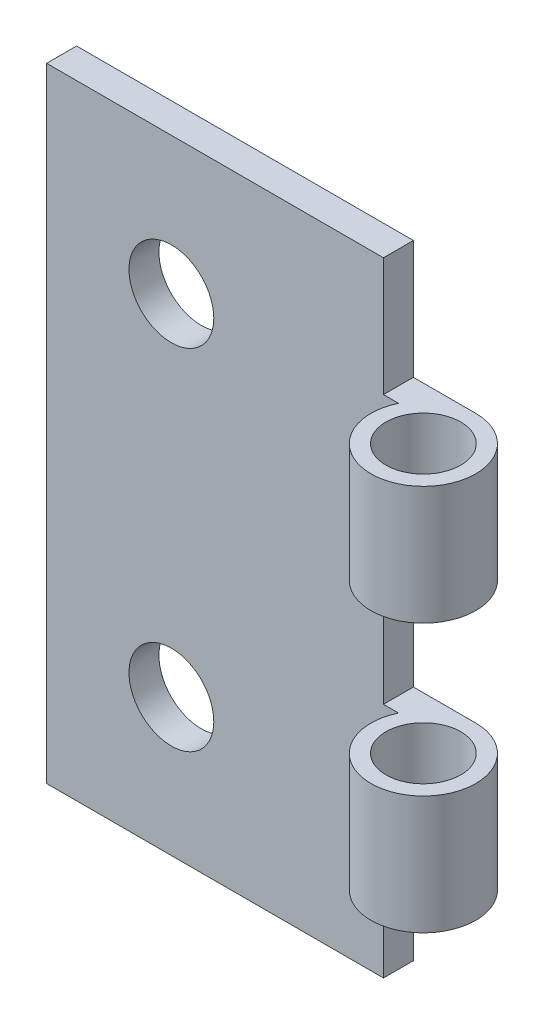
ISO-10303-21;
HEADER;
FILE_DESCRIPTION(('STEP AP214'),'2;1');
FILE_NAME('part.step','',(''),(''),'','','');
FILE_SCHEMA(('AUTOMOTIVE_DESIGN { 1 0 10303 214 1 1 1 1 }'));
ENDSEC;
DATA;
#1=APPLICATION_CONTEXT('core data for automotive mechanical design processes');
#2=APPLICATION_PROTOCOL_DEFINITION('international standard','automotive_design',2000,#1);
#3=PRODUCT_CONTEXT('',#1,'mechanical');
#4=PRODUCT('Part','Part','',(#3));
#5=PRODUCT_RELATED_PRODUCT_CATEGORY('part','',(#4));
#6=PRODUCT_DEFINITION_FORMATION('','',#4);
#7=PRODUCT_DEFINITION_CONTEXT('part definition',#1,'design');
#8=PRODUCT_DEFINITION('design','',#6,#7);
#9=PRODUCT_DEFINITION_SHAPE('','',#8);
#10=(LENGTH_UNIT() NAMED_UNIT(*) SI_UNIT(.MILLI.,.METRE.));
#11=(NAMED_UNIT(*) PLANE_ANGLE_UNIT() SI_UNIT($,.RADIAN.));
#12=(NAMED_UNIT(*) SI_UNIT($,.STERADIAN.) SOLID_ANGLE_UNIT());
#13=UNCERTAINTY_MEASURE_WITH_UNIT(LENGTH_MEASURE(1.E-05),#10,'distance_accuracy_value','');
#14=(GEOMETRIC_REPRESENTATION_CONTEXT(3) GLOBAL_UNCERTAINTY_ASSIGNED_CONTEXT((#13)) GLOBAL_UNIT_ASSIGNED_CONTEXT((#10,
#11,#12)) REPRESENTATION_CONTEXT('',''));
#15=CARTESIAN_POINT('',(0.,0.,0.));
#16=DIRECTION('',(0.,0.,1.));
#17=DIRECTION('',(1.,0.,0.));
#18=AXIS2_PLACEMENT_3D('',#15,#16,#17);
#19=CARTESIAN_POINT('',(9.25,7.75,2.1));
#20=DIRECTION('',(0.,-1.,0.));
#21=DIRECTION('',(0.,0.,-1.));
#22=AXIS2_PLACEMENT_3D('',#19,#20,#21);
#23=CYLINDRICAL_SURFACE('',#22,2.1);
#24=CARTESIAN_POINT('',(9.25,3.,2.1));
#25=DIRECTION('',(0.,1.,0.));
#26=DIRECTION('',(0.,0.,1.));
#27=AXIS2_PLACEMENT_3D('',#24,#25,#26);
#28=CIRCLE('',#27,2.1);
#29=CARTESIAN_POINT('',(9.25,3.,0.));
#30=VERTEX_POINT('',#29);
#31=CARTESIAN_POINT('',(7.35263340389897,3.,1.2));
#32=VERTEX_POINT('',#31);
#33=EDGE_CURVE('E212',#30,#32,#28,.F.);
#34=ORIENTED_EDGE('',*,*,#33,.F.);
#35=DIRECTION('',(0.,-1.,0.));
#36=VECTOR('',#35,1.);
#37=CARTESIAN_POINT('',(9.25,0.,0.));
#38=LINE('',#37,#36);
#39=CARTESIAN_POINT('',(9.25,7.75,0.));
#40=VERTEX_POINT('',#39);
#41=EDGE_CURVE('E178',#40,#30,#38,.T.);
#42=ORIENTED_EDGE('',*,*,#41,.F.);
#43=CARTESIAN_POINT('',(9.25,7.75,2.1));
#44=DIRECTION('',(0.,-1.,0.));
#45=DIRECTION('',(0.,0.,-1.));
#46=AXIS2_PLACEMENT_3D('',#43,#44,#45);
#47=CIRCLE('',#46,2.1);
#48=CARTESIAN_POINT('',(7.35263340389897,7.75,1.2));
#49=VERTEX_POINT('',#48);
#50=EDGE_CURVE('E218',#40,#49,#47,.T.);
#51=ORIENTED_EDGE('',*,*,#50,.T.);
#52=DIRECTION('',(0.,-1.,0.));
#53=VECTOR('',#52,1.);
#54=CARTESIAN_POINT('',(7.35263340389897,7.75,1.2));
#55=LINE('',#54,#53);
#56=EDGE_CURVE('E143',#49,#32,#55,.T.);
#57=ORIENTED_EDGE('',*,*,#56,.T.);
#58=EDGE_LOOP('',(#34,#42,#51,#57));
#59=FACE_BOUND('',#58,.T.);
#60=ADVANCED_FACE('F36',(#59),#23,.T.);
#61=CARTESIAN_POINT('',(9.25,10.25,2.1));
#62=DIRECTION('',(0.,-1.,0.));
#63=DIRECTION('',(0.,0.,-1.));
#64=AXIS2_PLACEMENT_3D('',#61,#62,#63);
#65=CYLINDRICAL_SURFACE('',#64,1.5);
#66=CARTESIAN_POINT('',(9.25,3.,2.1));
#67=DIRECTION('',(0.,1.,0.));
#68=DIRECTION('',(0.,0.,1.));
#69=AXIS2_PLACEMENT_3D('',#66,#67,#68);
#70=CIRCLE('',#69,1.5);
#71=CARTESIAN_POINT('',(9.25,3.,3.6));
#72=VERTEX_POINT('',#71);
#73=EDGE_CURVE('E40',#72,#72,#70,.F.);
#74=ORIENTED_EDGE('',*,*,#73,.T.);
#75=EDGE_LOOP('',(#74));
#76=FACE_BOUND('',#75,.T.);
#77=CARTESIAN_POINT('',(9.25,7.75,2.1));
#78=DIRECTION('',(0.,1.,0.));
#79=DIRECTION('',(-1.,0.,0.));
#80=AXIS2_PLACEMENT_3D('',#77,#78,#79);
#81=CIRCLE('',#80,1.5);
#82=CARTESIAN_POINT('',(7.75,7.75,2.1));
#83=VERTEX_POINT('',#82);
#84=EDGE_CURVE('E194',#83,#83,#81,.T.);
#85=ORIENTED_EDGE('',*,*,#84,.T.);
#86=EDGE_LOOP('',(#85));
#87=FACE_BOUND('',#86,.T.);
#88=ADVANCED_FACE('F275',(#76,#87),#65,.F.);
#89=CARTESIAN_POINT('',(-6.75,0.,1.2));
#90=DIRECTION('',(-1.,0.,0.));
#91=DIRECTION('',(0.,0.,1.));
#92=AXIS2_PLACEMENT_3D('',#89,#90,#91);
#93=PLANE('',#92);
#94=DIRECTION('',(0.,1.,0.));
#95=VECTOR('',#94,1.);
#96=CARTESIAN_POINT('',(-6.75,0.,0.));
#97=LINE('',#96,#95);
#98=CARTESIAN_POINT('',(-6.75,-12.5,0.));
#99=VERTEX_POINT('',#98);
#100=CARTESIAN_POINT('',(-6.75,12.5,0.));
#101=VERTEX_POINT('',#100);
#102=EDGE_CURVE('E156',#99,#101,#97,.T.);
#103=ORIENTED_EDGE('',*,*,#102,.F.);
#104=DIRECTION('',(0.,0.,-1.));
#105=VECTOR('',#104,1.);
#106=CARTESIAN_POINT('',(-6.75,-12.5,1.2));
#107=LINE('',#106,#105);
#108=CARTESIAN_POINT('',(-6.75,-12.5,1.2));
#109=VERTEX_POINT('',#108);
#110=EDGE_CURVE('E11',#109,#99,#107,.T.);
#111=ORIENTED_EDGE('',*,*,#110,.F.);
#112=DIRECTION('',(0.,1.,0.));
#113=VECTOR('',#112,1.);
#114=CARTESIAN_POINT('',(-6.75,0.,1.2));
#115=LINE('',#114,#113);
#116=CARTESIAN_POINT('',(-6.75,12.5,1.2));
#117=VERTEX_POINT('',#116);
#118=EDGE_CURVE('E231',#109,#117,#115,.T.);
#119=ORIENTED_EDGE('',*,*,#118,.T.);
#120=DIRECTION('',(0.,0.,-1.));
#121=VECTOR('',#120,1.);
#122=CARTESIAN_POINT('',(-6.75,12.5,1.2));
#123=LINE('',#122,#121);
#124=EDGE_CURVE('E97',#117,#101,#123,.T.);
#125=ORIENTED_EDGE('',*,*,#124,.T.);
#126=EDGE_LOOP('',(#103,#111,#119,#125));
#127=FACE_BOUND('',#126,.T.);
#128=ADVANCED_FACE('F281',(#127),#93,.T.);
#129=CARTESIAN_POINT('',(0.,-12.5,1.2));
#130=DIRECTION('',(0.,-1.,0.));
#131=DIRECTION('',(1.,0.,0.));
#132=AXIS2_PLACEMENT_3D('',#129,#130,#131);
#133=PLANE('',#132);
#134=DIRECTION('',(-1.,0.,0.));
#135=VECTOR('',#134,1.);
#136=CARTESIAN_POINT('',(0.,-12.5,0.));
#137=LINE('',#136,#135);
#138=CARTESIAN_POINT('',(6.75,-12.5,0.));
#139=VERTEX_POINT('',#138);
#140=EDGE_CURVE('E158',#139,#99,#137,.T.);
#141=ORIENTED_EDGE('',*,*,#140,.F.);
#142=DIRECTION('',(0.,0.,-1.));
#143=VECTOR('',#142,1.);
#144=CARTESIAN_POINT('',(6.75,-12.5,1.2));
#145=LINE('',#144,#143);
#146=CARTESIAN_POINT('',(6.75,-12.5,1.2));
#147=VERTEX_POINT('',#146);
#148=EDGE_CURVE('E46',#147,#139,#145,.T.);
#149=ORIENTED_EDGE('',*,*,#148,.F.);
#150=DIRECTION('',(-1.,0.,0.));
#151=VECTOR('',#150,1.);
#152=CARTESIAN_POINT('',(0.,-12.5,1.2));
#153=LINE('',#152,#151);
#154=EDGE_CURVE('E233',#147,#109,#153,.T.);
#155=ORIENTED_EDGE('',*,*,#154,.T.);
#156=ORIENTED_EDGE('',*,*,#110,.T.);
#157=EDGE_LOOP('',(#141,#149,#155,#156));
#158=FACE_BOUND('',#157,.T.);
#159=ADVANCED_FACE('F303',(#158),#133,.T.);
#160=CARTESIAN_POINT('',(6.75,0.,1.2));
#161=DIRECTION('',(-1.,0.,0.));
#162=DIRECTION('',(0.,0.,1.));
#163=AXIS2_PLACEMENT_3D('',#160,#161,#162);
#164=PLANE('',#163);
#165=DIRECTION('',(0.,1.,0.));
#166=VECTOR('',#165,1.);
#167=CARTESIAN_POINT('',(6.75,0.,0.));
#168=LINE('',#167,#166);
#169=CARTESIAN_POINT('',(6.75,-7.75,0.));
#170=VERTEX_POINT('',#169);
#171=EDGE_CURVE('E161',#139,#170,#168,.T.);
#172=ORIENTED_EDGE('',*,*,#171,.T.);
#173=DIRECTION('',(0.,0.,-1.));
#174=VECTOR('',#173,1.);
#175=CARTESIAN_POINT('',(6.75,-7.75,1.2));
#176=LINE('',#175,#174);
#177=CARTESIAN_POINT('',(6.75,-7.75,1.2));
#178=VERTEX_POINT('',#177);
#179=EDGE_CURVE('E190',#178,#170,#176,.T.);
#180=ORIENTED_EDGE('',*,*,#179,.F.);
#181=DIRECTION('',(0.,1.,0.));
#182=VECTOR('',#181,1.);
#183=CARTESIAN_POINT('',(6.75,0.,1.2));
#184=LINE('',#183,#182);
#185=EDGE_CURVE('E137',#147,#178,#184,.T.);
#186=ORIENTED_EDGE('',*,*,#185,.F.);
#187=ORIENTED_EDGE('',*,*,#148,.T.);
#188=EDGE_LOOP('',(#172,#180,#186,#187));
#189=FACE_BOUND('',#188,.T.);
#190=ADVANCED_FACE('F270',(#189),#164,.F.);
#191=CARTESIAN_POINT('',(0.,-7.75,1.2));
#192=DIRECTION('',(0.,1.,0.));
#193=DIRECTION('',(0.,0.,1.));
#194=AXIS2_PLACEMENT_3D('',#191,#192,#193);
#195=PLANE('',#194);
#196=CARTESIAN_POINT('',(9.25,-7.75,2.1));
#197=DIRECTION('',(0.,-1.,0.));
#198=DIRECTION('',(0.,0.,-1.));
#199=AXIS2_PLACEMENT_3D('',#196,#197,#198);
#200=CIRCLE('',#199,1.5);
#201=CARTESIAN_POINT('',(9.25,-7.75,0.600000000000002));
#202=VERTEX_POINT('',#201);
#203=EDGE_CURVE('E197',#202,#202,#200,.T.);
#204=ORIENTED_EDGE('',*,*,#203,.F.);
#205=EDGE_LOOP('',(#204));
#206=FACE_BOUND('',#205,.T.);
#207=DIRECTION('',(1.,0.,0.));
#208=VECTOR('',#207,1.);
#209=CARTESIAN_POINT('',(0.,-7.75,0.));
#210=LINE('',#209,#208);
#211=CARTESIAN_POINT('',(9.25,-7.75,0.));
#212=VERTEX_POINT('',#211);
#213=EDGE_CURVE('E164',#170,#212,#210,.T.);
#214=ORIENTED_EDGE('',*,*,#213,.T.);
#215=CARTESIAN_POINT('',(9.25,-7.75,2.1));
#216=DIRECTION('',(0.,-1.,0.));
#217=DIRECTION('',(0.,0.,-1.));
#218=AXIS2_PLACEMENT_3D('',#215,#216,#217);
#219=CIRCLE('',#218,2.1);
#220=CARTESIAN_POINT('',(7.35263340389897,-7.75,1.2));
#221=VERTEX_POINT('',#220);
#222=EDGE_CURVE('E196',#212,#221,#219,.T.);
#223=ORIENTED_EDGE('',*,*,#222,.T.);
#224=DIRECTION('',(1.,0.,0.));
#225=VECTOR('',#224,1.);
#226=CARTESIAN_POINT('',(0.,-7.75,1.2));
#227=LINE('',#226,#225);
#228=EDGE_CURVE('E237',#178,#221,#227,.T.);
#229=ORIENTED_EDGE('',*,*,#228,.F.);
#230=ORIENTED_EDGE('',*,*,#179,.T.);
#231=EDGE_LOOP('',(#214,#223,#229,#230));
#232=FACE_BOUND('',#231,.T.);
#233=ADVANCED_FACE('F263',(#206,#232),#195,.F.);
#234=CARTESIAN_POINT('',(0.,-3.,1.2));
#235=DIRECTION('',(0.,1.,0.));
#236=DIRECTION('',(-1.,0.,0.));
#237=AXIS2_PLACEMENT_3D('',#234,#235,#236);
#238=PLANE('',#237);
#239=DIRECTION('',(1.,0.,0.));
#240=VECTOR('',#239,1.);
#241=CARTESIAN_POINT('',(0.,-3.,1.2));
#242=LINE('',#241,#240);
#243=CARTESIAN_POINT('',(6.75,-3.,1.2));
#244=VERTEX_POINT('',#243);
#245=CARTESIAN_POINT('',(7.35263340389897,-3.,1.2));
#246=VERTEX_POINT('',#245);
#247=EDGE_CURVE('E239',#244,#246,#242,.T.);
#248=ORIENTED_EDGE('',*,*,#247,.T.);
#249=CARTESIAN_POINT('',(9.25,-3.,2.1));
#250=DIRECTION('',(0.,-1.,0.));
#251=DIRECTION('',(1.,0.,0.));
#252=AXIS2_PLACEMENT_3D('',#249,#250,#251);
#253=CIRCLE('',#252,2.1);
#254=CARTESIAN_POINT('',(9.25,-3.,0.));
#255=VERTEX_POINT('',#254);
#256=EDGE_CURVE('E200',#246,#255,#253,.F.);
#257=ORIENTED_EDGE('',*,*,#256,.T.);
#258=DIRECTION('',(1.,0.,0.));
#259=VECTOR('',#258,1.);
#260=CARTESIAN_POINT('',(0.,-3.,0.));
#261=LINE('',#260,#259);
#262=CARTESIAN_POINT('',(6.75,-3.,0.));
#263=VERTEX_POINT('',#262);
#264=EDGE_CURVE('E172',#263,#255,#261,.T.);
#265=ORIENTED_EDGE('',*,*,#264,.F.);
#266=DIRECTION('',(0.,0.,-1.));
#267=VECTOR('',#266,1.);
#268=CARTESIAN_POINT('',(6.75,-3.,1.2));
#269=LINE('',#268,#267);
#270=EDGE_CURVE('E188',#244,#263,#269,.T.);
#271=ORIENTED_EDGE('',*,*,#270,.F.);
#272=EDGE_LOOP('',(#248,#257,#265,#271));
#273=FACE_BOUND('',#272,.T.);
#274=CARTESIAN_POINT('',(9.25,-3.,2.1));
#275=DIRECTION('',(0.,-1.,0.));
#276=DIRECTION('',(1.,0.,0.));
#277=AXIS2_PLACEMENT_3D('',#274,#275,#276);
#278=CIRCLE('',#277,1.5);
#279=CARTESIAN_POINT('',(10.75,-3.,2.1));
#280=VERTEX_POINT('',#279);
#281=EDGE_CURVE('E198',#280,#280,#278,.F.);
#282=ORIENTED_EDGE('',*,*,#281,.F.);
#283=EDGE_LOOP('',(#282));
#284=FACE_BOUND('',#283,.T.);
#285=ADVANCED_FACE('F260',(#273,#284),#238,.T.);
#286=CARTESIAN_POINT('',(6.75,3.,0.));
#287=VERTEX_POINT('',#286);
#288=EDGE_CURVE('E166',#263,#287,#168,.T.);
#289=ORIENTED_EDGE('',*,*,#288,.T.);
#290=DIRECTION('',(0.,0.,-1.));
#291=VECTOR('',#290,1.);
#292=CARTESIAN_POINT('',(6.75,3.,1.2));
#293=LINE('',#292,#291);
#294=CARTESIAN_POINT('',(6.75,3.,1.2));
#295=VERTEX_POINT('',#294);
#296=EDGE_CURVE('E129',#295,#287,#293,.T.);
#297=ORIENTED_EDGE('',*,*,#296,.F.);
#298=EDGE_CURVE('E136',#244,#295,#184,.T.);
#299=ORIENTED_EDGE('',*,*,#298,.F.);
#300=ORIENTED_EDGE('',*,*,#270,.T.);
#301=EDGE_LOOP('',(#289,#297,#299,#300));
#302=FACE_BOUND('',#301,.T.);
#303=ADVANCED_FACE('F248',(#302),#164,.F.);
#304=CARTESIAN_POINT('',(0.,3.,1.2));
#305=DIRECTION('',(0.,1.,0.));
#306=DIRECTION('',(-1.,0.,0.));
#307=AXIS2_PLACEMENT_3D('',#304,#305,#306);
#308=PLANE('',#307);
#309=DIRECTION('',(1.,0.,0.));
#310=VECTOR('',#309,1.);
#311=CARTESIAN_POINT('',(0.,3.,0.));
#312=LINE('',#311,#310);
#313=EDGE_CURVE('E175',#287,#30,#312,.T.);
#314=ORIENTED_EDGE('',*,*,#313,.T.);
#315=ORIENTED_EDGE('',*,*,#33,.T.);
#316=DIRECTION('',(1.,0.,0.));
#317=VECTOR('',#316,1.);
#318=CARTESIAN_POINT('',(0.,3.,1.2));
#319=LINE('',#318,#317);
#320=EDGE_CURVE('E144',#295,#32,#319,.T.);
#321=ORIENTED_EDGE('',*,*,#320,.F.);
#322=ORIENTED_EDGE('',*,*,#296,.T.);
#323=EDGE_LOOP('',(#314,#315,#321,#322));
#324=FACE_BOUND('',#323,.T.);
#325=ORIENTED_EDGE('',*,*,#73,.F.);
#326=EDGE_LOOP('',(#325));
#327=FACE_BOUND('',#326,.T.);
#328=ADVANCED_FACE('F251',(#324,#327),#308,.F.);
#329=CARTESIAN_POINT('',(0.,7.74999999999999,1.2));
#330=DIRECTION('',(0.,1.,0.));
#331=DIRECTION('',(-1.,0.,0.));
#332=AXIS2_PLACEMENT_3D('',#329,#330,#331);
#333=PLANE('',#332);
#334=ORIENTED_EDGE('',*,*,#84,.F.);
#335=EDGE_LOOP('',(#334));
#336=FACE_BOUND('',#335,.T.);
#337=ORIENTED_EDGE('',*,*,#50,.F.);
#338=DIRECTION('',(1.,0.,0.));
#339=VECTOR('',#338,1.);
#340=CARTESIAN_POINT('',(0.,7.74999999999999,0.));
#341=LINE('',#340,#339);
#342=CARTESIAN_POINT('',(6.75,7.75,0.));
#343=VERTEX_POINT('',#342);
#344=EDGE_CURVE('E126',#343,#40,#341,.T.);
#345=ORIENTED_EDGE('',*,*,#344,.F.);
#346=DIRECTION('',(0.,0.,-1.));
#347=VECTOR('',#346,1.);
#348=CARTESIAN_POINT('',(6.75,7.75,1.2));
#349=LINE('',#348,#347);
#350=CARTESIAN_POINT('',(6.75,7.75,1.2));
#351=VERTEX_POINT('',#350);
#352=EDGE_CURVE('E118',#351,#343,#349,.T.);
#353=ORIENTED_EDGE('',*,*,#352,.F.);
#354=DIRECTION('',(1.,0.,0.));
#355=VECTOR('',#354,1.);
#356=CARTESIAN_POINT('',(0.,7.74999999999999,1.2));
#357=LINE('',#356,#355);
#358=EDGE_CURVE('E124',#351,#49,#357,.T.);
#359=ORIENTED_EDGE('',*,*,#358,.T.);
#360=EDGE_LOOP('',(#337,#345,#353,#359));
#361=FACE_BOUND('',#360,.T.);
#362=ADVANCED_FACE('F121',(#336,#361),#333,.T.);
#363=CARTESIAN_POINT('',(6.75,12.5,0.));
#364=VERTEX_POINT('',#363);
#365=EDGE_CURVE('E165',#343,#364,#168,.T.);
#366=ORIENTED_EDGE('',*,*,#365,.T.);
#367=DIRECTION('',(0.,0.,-1.));
#368=VECTOR('',#367,1.);
#369=CARTESIAN_POINT('',(6.75,12.5,1.2));
#370=LINE('',#369,#368);
#371=CARTESIAN_POINT('',(6.75,12.5,1.2));
#372=VERTEX_POINT('',#371);
#373=EDGE_CURVE('E130',#372,#364,#370,.T.);
#374=ORIENTED_EDGE('',*,*,#373,.F.);
#375=EDGE_CURVE('E133',#351,#372,#184,.T.);
#376=ORIENTED_EDGE('',*,*,#375,.F.);
#377=ORIENTED_EDGE('',*,*,#352,.T.);
#378=EDGE_LOOP('',(#366,#374,#376,#377));
#379=FACE_BOUND('',#378,.T.);
#380=ADVANCED_FACE('F134',(#379),#164,.F.);
#381=CARTESIAN_POINT('',(-1.75,7.,1.2));
#382=DIRECTION('',(0.,0.,-1.));
#383=DIRECTION('',(-1.,0.,0.));
#384=AXIS2_PLACEMENT_3D('',#381,#382,#383);
#385=CYLINDRICAL_SURFACE('',#384,1.7);
#386=CARTESIAN_POINT('',(-1.75,7.,1.2));
#387=DIRECTION('',(0.,0.,1.));
#388=DIRECTION('',(1.,0.,0.));
#389=AXIS2_PLACEMENT_3D('',#386,#387,#388);
#390=CIRCLE('',#389,1.7);
#391=CARTESIAN_POINT('',(-0.0500000000000008,7.,1.2));
#392=VERTEX_POINT('',#391);
#393=EDGE_CURVE('E228',#392,#392,#390,.T.);
#394=ORIENTED_EDGE('',*,*,#393,.T.);
#395=EDGE_LOOP('',(#394));
#396=FACE_BOUND('',#395,.T.);
#397=CARTESIAN_POINT('',(-1.75,7.,0.));
#398=DIRECTION('',(0.,0.,1.));
#399=DIRECTION('',(1.,0.,0.));
#400=AXIS2_PLACEMENT_3D('',#397,#398,#399);
#401=CIRCLE('',#400,1.7);
#402=CARTESIAN_POINT('',(-0.0500000000000008,7.,0.));
#403=VERTEX_POINT('',#402);
#404=EDGE_CURVE('E153',#403,#403,#401,.T.);
#405=ORIENTED_EDGE('',*,*,#404,.F.);
#406=EDGE_LOOP('',(#405));
#407=FACE_BOUND('',#406,.T.);
#408=ADVANCED_FACE('F310',(#396,#407),#385,.F.);
#409=CARTESIAN_POINT('',(-1.75,-7.,1.2));
#410=DIRECTION('',(0.,0.,-1.));
#411=DIRECTION('',(-1.,0.,0.));
#412=AXIS2_PLACEMENT_3D('',#409,#410,#411);
#413=CYLINDRICAL_SURFACE('',#412,1.7);
#414=CARTESIAN_POINT('',(-1.75,-7.,1.2));
#415=DIRECTION('',(0.,0.,1.));
#416=DIRECTION('',(1.,0.,0.));
#417=AXIS2_PLACEMENT_3D('',#414,#415,#416);
#418=CIRCLE('',#417,1.7);
#419=CARTESIAN_POINT('',(-0.0500000000000008,-7.,1.2));
#420=VERTEX_POINT('',#419);
#421=EDGE_CURVE('E183',#420,#420,#418,.T.);
#422=ORIENTED_EDGE('',*,*,#421,.T.);
#423=EDGE_LOOP('',(#422));
#424=FACE_BOUND('',#423,.T.);
#425=CARTESIAN_POINT('',(-1.75,-7.,0.));
#426=DIRECTION('',(0.,0.,1.));
#427=DIRECTION('',(1.,0.,0.));
#428=AXIS2_PLACEMENT_3D('',#425,#426,#427);
#429=CIRCLE('',#428,1.7);
#430=CARTESIAN_POINT('',(-0.0500000000000008,-7.,0.));
#431=VERTEX_POINT('',#430);
#432=EDGE_CURVE('E150',#431,#431,#429,.T.);
#433=ORIENTED_EDGE('',*,*,#432,.F.);
#434=EDGE_LOOP('',(#433));
#435=FACE_BOUND('',#434,.T.);
#436=ADVANCED_FACE('F38',(#424,#435),#413,.F.);
#437=CARTESIAN_POINT('',(0.,12.5,1.2));
#438=DIRECTION('',(0.,-1.,0.));
#439=DIRECTION('',(1.,0.,0.));
#440=AXIS2_PLACEMENT_3D('',#437,#438,#439);
#441=PLANE('',#440);
#442=DIRECTION('',(-1.,0.,0.));
#443=VECTOR('',#442,1.);
#444=CARTESIAN_POINT('',(0.,12.5,0.));
#445=LINE('',#444,#443);
#446=EDGE_CURVE('E90',#364,#101,#445,.T.);
#447=ORIENTED_EDGE('',*,*,#446,.T.);
#448=ORIENTED_EDGE('',*,*,#124,.F.);
#449=DIRECTION('',(-1.,0.,0.));
#450=VECTOR('',#449,1.);
#451=CARTESIAN_POINT('',(0.,12.5,1.2));
#452=LINE('',#451,#450);
#453=EDGE_CURVE('E55',#372,#117,#452,.T.);
#454=ORIENTED_EDGE('',*,*,#453,.F.);
#455=ORIENTED_EDGE('',*,*,#373,.T.);
#456=EDGE_LOOP('',(#447,#448,#454,#455));
#457=FACE_BOUND('',#456,.T.);
#458=ADVANCED_FACE('F317',(#457),#441,.F.);
#459=CARTESIAN_POINT('',(0.,0.,1.2));
#460=DIRECTION('',(0.,0.,1.));
#461=DIRECTION('',(1.,0.,0.));
#462=AXIS2_PLACEMENT_3D('',#459,#460,#461);
#463=PLANE('',#462);
#464=ORIENTED_EDGE('',*,*,#56,.F.);
#465=ORIENTED_EDGE('',*,*,#358,.F.);
#466=ORIENTED_EDGE('',*,*,#375,.T.);
#467=ORIENTED_EDGE('',*,*,#453,.T.);
#468=ORIENTED_EDGE('',*,*,#118,.F.);
#469=ORIENTED_EDGE('',*,*,#154,.F.);
#470=ORIENTED_EDGE('',*,*,#185,.T.);
#471=ORIENTED_EDGE('',*,*,#228,.T.);
#472=EDGE_CURVE('E221',#246,#221,#55,.T.);
#473=ORIENTED_EDGE('',*,*,#472,.F.);
#474=ORIENTED_EDGE('',*,*,#247,.F.);
#475=ORIENTED_EDGE('',*,*,#298,.T.);
#476=ORIENTED_EDGE('',*,*,#320,.T.);
#477=EDGE_LOOP('',(#464,#465,#466,#467,#468,#469,#470,#471,#473,#474,#475,#476));
#478=FACE_BOUND('',#477,.T.);
#479=ORIENTED_EDGE('',*,*,#421,.F.);
#480=EDGE_LOOP('',(#479));
#481=FACE_BOUND('',#480,.T.);
#482=ORIENTED_EDGE('',*,*,#393,.F.);
#483=EDGE_LOOP('',(#482));
#484=FACE_BOUND('',#483,.T.);
#485=ADVANCED_FACE('F139',(#478,#481,#484),#463,.T.);
#486=CARTESIAN_POINT('',(0.,0.,0.));
#487=DIRECTION('',(0.,0.,1.));
#488=DIRECTION('',(1.,0.,0.));
#489=AXIS2_PLACEMENT_3D('',#486,#487,#488);
#490=PLANE('',#489);
#491=ORIENTED_EDGE('',*,*,#432,.T.);
#492=EDGE_LOOP('',(#491));
#493=FACE_BOUND('',#492,.T.);
#494=ORIENTED_EDGE('',*,*,#404,.T.);
#495=EDGE_LOOP('',(#494));
#496=FACE_BOUND('',#495,.T.);
#497=ORIENTED_EDGE('',*,*,#102,.T.);
#498=ORIENTED_EDGE('',*,*,#446,.F.);
#499=ORIENTED_EDGE('',*,*,#365,.F.);
#500=ORIENTED_EDGE('',*,*,#344,.T.);
#501=ORIENTED_EDGE('',*,*,#41,.T.);
#502=ORIENTED_EDGE('',*,*,#313,.F.);
#503=ORIENTED_EDGE('',*,*,#288,.F.);
#504=ORIENTED_EDGE('',*,*,#264,.T.);
#505=DIRECTION('',(0.,-1.,0.));
#506=VECTOR('',#505,1.);
#507=CARTESIAN_POINT('',(9.25,0.,0.));
#508=LINE('',#507,#506);
#509=EDGE_CURVE('E169',#255,#212,#508,.T.);
#510=ORIENTED_EDGE('',*,*,#509,.T.);
#511=ORIENTED_EDGE('',*,*,#213,.F.);
#512=ORIENTED_EDGE('',*,*,#171,.F.);
#513=ORIENTED_EDGE('',*,*,#140,.T.);
#514=EDGE_LOOP('',(#497,#498,#499,#500,#501,#502,#503,#504,#510,#511,#512,#513));
#515=FACE_BOUND('',#514,.T.);
#516=ADVANCED_FACE('F259',(#493,#496,#515),#490,.F.);
#517=ORIENTED_EDGE('',*,*,#509,.F.);
#518=ORIENTED_EDGE('',*,*,#256,.F.);
#519=ORIENTED_EDGE('',*,*,#472,.T.);
#520=ORIENTED_EDGE('',*,*,#222,.F.);
#521=EDGE_LOOP('',(#517,#518,#519,#520));
#522=FACE_BOUND('',#521,.T.);
#523=ADVANCED_FACE('F277',(#522),#23,.T.);
#524=ORIENTED_EDGE('',*,*,#281,.T.);
#525=EDGE_LOOP('',(#524));
#526=FACE_BOUND('',#525,.T.);
#527=ORIENTED_EDGE('',*,*,#203,.T.);
#528=EDGE_LOOP('',(#527));
#529=FACE_BOUND('',#528,.T.);
#530=ADVANCED_FACE('F284',(#526,#529),#65,.F.);
#531=CLOSED_SHELL('',(#60,#88,#128,#159,#190,#233,#285,#303,#328,#362,#380,#408,#436,#458,#485,
#516,#523,#530));
#532=MANIFOLD_SOLID_BREP('B2',#531);
#533=ADVANCED_BREP_SHAPE_REPRESENTATION('',(#18,#532),#14);
#534=SHAPE_DEFINITION_REPRESENTATION(#9,#533);
ENDSEC;
END-ISO-10303-21;
